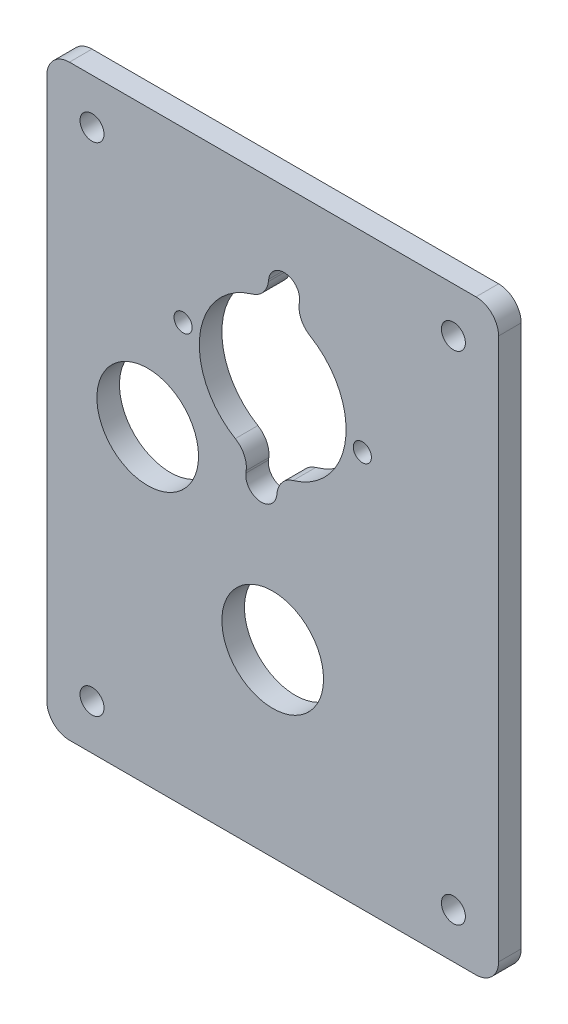
ISO-10303-21;
HEADER;
FILE_DESCRIPTION(('STEP AP214'),'2;1');
FILE_NAME('part.step','',(''),(''),'','','');
FILE_SCHEMA(('AUTOMOTIVE_DESIGN { 1 0 10303 214 1 1 1 1 }'));
ENDSEC;
DATA;
#1=APPLICATION_CONTEXT('core data for automotive mechanical design processes');
#2=APPLICATION_PROTOCOL_DEFINITION('international standard','automotive_design',2000,#1);
#3=PRODUCT_CONTEXT('',#1,'mechanical');
#4=PRODUCT('Part','Part','',(#3));
#5=PRODUCT_RELATED_PRODUCT_CATEGORY('part','',(#4));
#6=PRODUCT_DEFINITION_FORMATION('','',#4);
#7=PRODUCT_DEFINITION_CONTEXT('part definition',#1,'design');
#8=PRODUCT_DEFINITION('design','',#6,#7);
#9=PRODUCT_DEFINITION_SHAPE('','',#8);
#10=(LENGTH_UNIT() NAMED_UNIT(*) SI_UNIT(.MILLI.,.METRE.));
#11=(NAMED_UNIT(*) PLANE_ANGLE_UNIT() SI_UNIT($,.RADIAN.));
#12=(NAMED_UNIT(*) SI_UNIT($,.STERADIAN.) SOLID_ANGLE_UNIT());
#13=UNCERTAINTY_MEASURE_WITH_UNIT(LENGTH_MEASURE(1.E-05),#10,'distance_accuracy_value','');
#14=(GEOMETRIC_REPRESENTATION_CONTEXT(3) GLOBAL_UNCERTAINTY_ASSIGNED_CONTEXT((#13)) GLOBAL_UNIT_ASSIGNED_CONTEXT((#10,
#11,#12)) REPRESENTATION_CONTEXT('',''));
#15=CARTESIAN_POINT('',(0.,0.,0.));
#16=DIRECTION('',(0.,0.,1.));
#17=DIRECTION('',(1.,0.,0.));
#18=AXIS2_PLACEMENT_3D('',#15,#16,#17);
#19=CARTESIAN_POINT('',(0.,0.,6.35));
#20=DIRECTION('',(0.,0.,-1.));
#21=DIRECTION('',(-1.,0.,0.));
#22=AXIS2_PLACEMENT_3D('',#19,#20,#21);
#23=PLANE('',#22);
#24=CARTESIAN_POINT('',(-50.8,-69.8500000000001,6.35));
#25=DIRECTION('',(0.,0.,1.));
#26=DIRECTION('',(1.,0.,0.));
#27=AXIS2_PLACEMENT_3D('',#24,#25,#26);
#28=CIRCLE('',#27,3.3734375);
#29=CARTESIAN_POINT('',(-47.4265625,-69.8500000000001,6.35));
#30=VERTEX_POINT('',#29);
#31=EDGE_CURVE('E315',#30,#30,#28,.T.);
#32=ORIENTED_EDGE('',*,*,#31,.F.);
#33=EDGE_LOOP('',(#32));
#34=FACE_BOUND('',#33,.T.);
#35=CARTESIAN_POINT('',(50.8,-69.8500000000001,6.35));
#36=DIRECTION('',(0.,0.,1.));
#37=DIRECTION('',(1.,0.,0.));
#38=AXIS2_PLACEMENT_3D('',#35,#36,#37);
#39=CIRCLE('',#38,3.3734375);
#40=CARTESIAN_POINT('',(54.1734375,-69.8500000000001,6.35));
#41=VERTEX_POINT('',#40);
#42=EDGE_CURVE('E323',#41,#41,#39,.T.);
#43=ORIENTED_EDGE('',*,*,#42,.F.);
#44=EDGE_LOOP('',(#43));
#45=FACE_BOUND('',#44,.T.);
#46=CARTESIAN_POINT('',(50.8,69.8499999999999,6.35));
#47=DIRECTION('',(0.,0.,1.));
#48=DIRECTION('',(1.,0.,0.));
#49=AXIS2_PLACEMENT_3D('',#46,#47,#48);
#50=CIRCLE('',#49,3.3734375);
#51=CARTESIAN_POINT('',(54.1734375,69.8499999999999,6.35));
#52=VERTEX_POINT('',#51);
#53=EDGE_CURVE('E331',#52,#52,#50,.T.);
#54=ORIENTED_EDGE('',*,*,#53,.F.);
#55=EDGE_LOOP('',(#54));
#56=FACE_BOUND('',#55,.T.);
#57=CARTESIAN_POINT('',(-50.8,69.8499999999999,6.35));
#58=DIRECTION('',(0.,0.,1.));
#59=DIRECTION('',(1.,0.,0.));
#60=AXIS2_PLACEMENT_3D('',#57,#58,#59);
#61=CIRCLE('',#60,3.3734375);
#62=CARTESIAN_POINT('',(-47.4265625,69.8499999999999,6.35));
#63=VERTEX_POINT('',#62);
#64=EDGE_CURVE('E339',#63,#63,#61,.T.);
#65=ORIENTED_EDGE('',*,*,#64,.F.);
#66=EDGE_LOOP('',(#65));
#67=FACE_BOUND('',#66,.T.);
#68=DIRECTION('',(-1.,0.,0.));
#69=VECTOR('',#68,1.);
#70=CARTESIAN_POINT('',(-63.5,82.55,6.35));
#71=LINE('',#70,#69);
#72=CARTESIAN_POINT('',(57.15,82.55,6.35));
#73=VERTEX_POINT('',#72);
#74=CARTESIAN_POINT('',(-57.15,82.55,6.35));
#75=VERTEX_POINT('',#74);
#76=EDGE_CURVE('E351',#73,#75,#71,.T.);
#77=ORIENTED_EDGE('',*,*,#76,.T.);
#78=CARTESIAN_POINT('',(-57.15,76.2,6.35));
#79=DIRECTION('',(0.,0.,-1.));
#80=DIRECTION('',(-1.,0.,0.));
#81=AXIS2_PLACEMENT_3D('',#78,#79,#80);
#82=CIRCLE('',#81,6.35);
#83=CARTESIAN_POINT('',(-63.5,76.2,6.35));
#84=VERTEX_POINT('',#83);
#85=EDGE_CURVE('E409',#75,#84,#82,.F.);
#86=ORIENTED_EDGE('',*,*,#85,.T.);
#87=DIRECTION('',(0.,-1.,0.));
#88=VECTOR('',#87,1.);
#89=CARTESIAN_POINT('',(-63.5,-82.55,6.35));
#90=LINE('',#89,#88);
#91=CARTESIAN_POINT('',(-63.5,-76.2,6.35));
#92=VERTEX_POINT('',#91);
#93=EDGE_CURVE('E356',#84,#92,#90,.T.);
#94=ORIENTED_EDGE('',*,*,#93,.T.);
#95=CARTESIAN_POINT('',(-57.15,-76.2,6.35));
#96=DIRECTION('',(0.,0.,-1.));
#97=DIRECTION('',(-1.,0.,0.));
#98=AXIS2_PLACEMENT_3D('',#95,#96,#97);
#99=CIRCLE('',#98,6.35);
#100=CARTESIAN_POINT('',(-57.15,-82.55,6.35));
#101=VERTEX_POINT('',#100);
#102=EDGE_CURVE('E59',#92,#101,#99,.F.);
#103=ORIENTED_EDGE('',*,*,#102,.T.);
#104=DIRECTION('',(1.,0.,0.));
#105=VECTOR('',#104,1.);
#106=CARTESIAN_POINT('',(-63.5,-82.55,6.35));
#107=LINE('',#106,#105);
#108=CARTESIAN_POINT('',(57.15,-82.55,6.35));
#109=VERTEX_POINT('',#108);
#110=EDGE_CURVE('E359',#101,#109,#107,.T.);
#111=ORIENTED_EDGE('',*,*,#110,.T.);
#112=CARTESIAN_POINT('',(57.15,-76.2,6.35));
#113=DIRECTION('',(0.,0.,-1.));
#114=DIRECTION('',(-1.,0.,0.));
#115=AXIS2_PLACEMENT_3D('',#112,#113,#114);
#116=CIRCLE('',#115,6.35);
#117=CARTESIAN_POINT('',(63.5,-76.2,6.35));
#118=VERTEX_POINT('',#117);
#119=EDGE_CURVE('E404',#109,#118,#116,.F.);
#120=ORIENTED_EDGE('',*,*,#119,.T.);
#121=DIRECTION('',(0.,1.,0.));
#122=VECTOR('',#121,1.);
#123=CARTESIAN_POINT('',(63.5,-82.55,6.35));
#124=LINE('',#123,#122);
#125=CARTESIAN_POINT('',(63.5,76.2,6.35));
#126=VERTEX_POINT('',#125);
#127=EDGE_CURVE('E347',#118,#126,#124,.T.);
#128=ORIENTED_EDGE('',*,*,#127,.T.);
#129=CARTESIAN_POINT('',(57.15,76.2,6.35));
#130=DIRECTION('',(0.,0.,-1.));
#131=DIRECTION('',(-1.,0.,0.));
#132=AXIS2_PLACEMENT_3D('',#129,#130,#131);
#133=CIRCLE('',#132,6.35);
#134=EDGE_CURVE('E401',#126,#73,#133,.F.);
#135=ORIENTED_EDGE('',*,*,#134,.T.);
#136=EDGE_LOOP('',(#77,#86,#94,#103,#111,#120,#128,#135));
#137=FACE_BOUND('',#136,.T.);
#138=CARTESIAN_POINT('',(-7.51246264820109,57.8730046433233,6.35));
#139=DIRECTION('',(0.,0.,-1.));
#140=DIRECTION('',(-1.,0.,0.));
#141=AXIS2_PLACEMENT_3D('',#138,#139,#140);
#142=CIRCLE('',#141,6.35);
#143=CARTESIAN_POINT('',(-1.21307670782635,57.0728566731271,6.35));
#144=VERTEX_POINT('',#143);
#145=CARTESIAN_POINT('',(-5.74482437803613,51.7739920227553,6.35));
#146=VERTEX_POINT('',#145);
#147=EDGE_CURVE('E177',#144,#146,#142,.T.);
#148=ORIENTED_EDGE('',*,*,#147,.F.);
#149=DIRECTION('',(-0.126007554361609,-0.992029281948777,0.));
#150=VECTOR('',#149,1.);
#151=CARTESIAN_POINT('',(-1.13338564619294,57.7002465709031,6.35));
#152=LINE('',#151,#150);
#153=CARTESIAN_POINT('',(-1.13338564619293,57.7002465709031,6.35));
#154=VERTEX_POINT('',#153);
#155=EDGE_CURVE('E236',#154,#144,#152,.T.);
#156=ORIENTED_EDGE('',*,*,#155,.F.);
#157=CARTESIAN_POINT('',(3.20059188078488,57.1497447674081,6.35));
#158=DIRECTION('',(0.,0.,1.));
#159=DIRECTION('',(1.,0.,0.));
#160=AXIS2_PLACEMENT_3D('',#157,#158,#159);
#161=CIRCLE('',#160,4.3688);
#162=CARTESIAN_POINT('',(7.5345694077627,56.5992429639131,6.35));
#163=VERTEX_POINT('',#162);
#164=EDGE_CURVE('E232',#163,#154,#161,.T.);
#165=ORIENTED_EDGE('',*,*,#164,.F.);
#166=DIRECTION('',(0.12600755436161,0.992029281948777,0.));
#167=VECTOR('',#166,1.);
#168=CARTESIAN_POINT('',(7.5345694077627,56.5992429639131,6.35));
#169=LINE('',#168,#167);
#170=CARTESIAN_POINT('',(7.45487834612928,55.9718530661371,6.35));
#171=VERTEX_POINT('',#170);
#172=EDGE_CURVE('E229',#171,#163,#169,.T.);
#173=ORIENTED_EDGE('',*,*,#172,.F.);
#174=CARTESIAN_POINT('',(13.754264286504,55.1717050959409,6.35));
#175=DIRECTION('',(0.,0.,-1.));
#176=DIRECTION('',(1.,0.,0.));
#177=AXIS2_PLACEMENT_3D('',#174,#175,#176);
#178=CIRCLE('',#177,6.35);
#179=CARTESIAN_POINT('',(10.5179668073266,49.7082923688746,6.35));
#180=VERTEX_POINT('',#179);
#181=EDGE_CURVE('E226',#180,#171,#178,.T.);
#182=ORIENTED_EDGE('',*,*,#181,.F.);
#183=CARTESIAN_POINT('',(0.,31.9522010059092,6.35));
#184=DIRECTION('',(0.,0.,1.));
#185=DIRECTION('',(1.,0.,0.));
#186=AXIS2_PLACEMENT_3D('',#183,#184,#185);
#187=CIRCLE('',#186,20.6375);
#188=CARTESIAN_POINT('',(5.74482437803612,12.130409989063,6.35));
#189=VERTEX_POINT('',#188);
#190=EDGE_CURVE('E223',#189,#180,#187,.T.);
#191=ORIENTED_EDGE('',*,*,#190,.F.);
#192=CARTESIAN_POINT('',(7.51246264820108,6.031397368495,6.35));
#193=DIRECTION('',(0.,0.,-1.));
#194=DIRECTION('',(-1.,0.,0.));
#195=AXIS2_PLACEMENT_3D('',#192,#193,#194);
#196=CIRCLE('',#195,6.35);
#197=CARTESIAN_POINT('',(1.21307670782635,6.83154533869122,6.35));
#198=VERTEX_POINT('',#197);
#199=EDGE_CURVE('E220',#198,#189,#196,.T.);
#200=ORIENTED_EDGE('',*,*,#199,.F.);
#201=DIRECTION('',(0.12600755436161,0.992029281948777,0.));
#202=VECTOR('',#201,1.);
#203=CARTESIAN_POINT('',(1.13338564619293,6.20415544091522,6.35));
#204=LINE('',#203,#202);
#205=CARTESIAN_POINT('',(1.13338564619293,6.20415544091522,6.35));
#206=VERTEX_POINT('',#205);
#207=EDGE_CURVE('E217',#206,#198,#204,.T.);
#208=ORIENTED_EDGE('',*,*,#207,.F.);
#209=CARTESIAN_POINT('',(-3.20059188078489,6.75465724441022,6.35));
#210=DIRECTION('',(0.,0.,1.));
#211=DIRECTION('',(1.,0.,0.));
#212=AXIS2_PLACEMENT_3D('',#209,#210,#211);
#213=CIRCLE('',#212,4.3688);
#214=CARTESIAN_POINT('',(-7.5345694077627,7.30515904790522,6.35));
#215=VERTEX_POINT('',#214);
#216=EDGE_CURVE('E214',#215,#206,#213,.T.);
#217=ORIENTED_EDGE('',*,*,#216,.F.);
#218=DIRECTION('',(-0.126007554361615,-0.992029281948776,0.));
#219=VECTOR('',#218,1.);
#220=CARTESIAN_POINT('',(-7.5345694077627,7.30515904790522,6.35));
#221=LINE('',#220,#219);
#222=CARTESIAN_POINT('',(-7.45487834612929,7.9325489456812,6.35));
#223=VERTEX_POINT('',#222);
#224=EDGE_CURVE('E208',#223,#215,#221,.T.);
#225=ORIENTED_EDGE('',*,*,#224,.F.);
#226=CARTESIAN_POINT('',(-13.754264286504,8.73269691587744,6.35));
#227=DIRECTION('',(0.,0.,-1.));
#228=DIRECTION('',(1.,0.,0.));
#229=AXIS2_PLACEMENT_3D('',#226,#227,#228);
#230=CIRCLE('',#229,6.35);
#231=CARTESIAN_POINT('',(-10.5179668073266,14.1961096429437,6.35));
#232=VERTEX_POINT('',#231);
#233=EDGE_CURVE('E203',#232,#223,#230,.T.);
#234=ORIENTED_EDGE('',*,*,#233,.F.);
#235=CARTESIAN_POINT('',(0.,31.9522010059092,6.35));
#236=DIRECTION('',(0.,0.,1.));
#237=DIRECTION('',(1.,0.,0.));
#238=AXIS2_PLACEMENT_3D('',#235,#236,#237);
#239=CIRCLE('',#238,20.6375);
#240=EDGE_CURVE('E188',#146,#232,#239,.T.);
#241=ORIENTED_EDGE('',*,*,#240,.F.);
#242=EDGE_LOOP('',(#148,#156,#165,#173,#182,#191,#200,#208,#217,#225,#234,#241));
#243=FACE_BOUND('',#242,.T.);
#244=CARTESIAN_POINT('',(0.,-31.9522010059092,6.35));
#245=DIRECTION('',(0.,0.,1.));
#246=DIRECTION('',(1.,0.,0.));
#247=AXIS2_PLACEMENT_3D('',#244,#245,#246);
#248=CIRCLE('',#247,14.2875);
#249=CARTESIAN_POINT('',(14.2875,-31.9522010059092,6.35));
#250=VERTEX_POINT('',#249);
#251=EDGE_CURVE('E242',#250,#250,#248,.T.);
#252=ORIENTED_EDGE('',*,*,#251,.F.);
#253=EDGE_LOOP('',(#252));
#254=FACE_BOUND('',#253,.T.);
#255=CARTESIAN_POINT('',(-35.1409,4.73236178540676,6.35));
#256=DIRECTION('',(0.,0.,1.));
#257=DIRECTION('',(1.,0.,0.));
#258=AXIS2_PLACEMENT_3D('',#255,#256,#257);
#259=CIRCLE('',#258,14.2875);
#260=CARTESIAN_POINT('',(-20.8534,4.73236178540676,6.35));
#261=VERTEX_POINT('',#260);
#262=EDGE_CURVE('E593',#261,#261,#259,.T.);
#263=ORIENTED_EDGE('',*,*,#262,.F.);
#264=EDGE_LOOP('',(#263));
#265=FACE_BOUND('',#264,.T.);
#266=CARTESIAN_POINT('',(25.1975437614989,28.7516091251243,6.35));
#267=DIRECTION('',(0.,0.,1.));
#268=DIRECTION('',(1.,0.,0.));
#269=AXIS2_PLACEMENT_3D('',#266,#267,#268);
#270=CIRCLE('',#269,2.5527);
#271=CARTESIAN_POINT('',(27.7502437614989,28.7516091251243,6.35));
#272=VERTEX_POINT('',#271);
#273=EDGE_CURVE('E586',#272,#272,#270,.T.);
#274=ORIENTED_EDGE('',*,*,#273,.F.);
#275=EDGE_LOOP('',(#274));
#276=FACE_BOUND('',#275,.T.);
#277=CARTESIAN_POINT('',(-25.1975437614989,35.1527928866941,6.35));
#278=DIRECTION('',(0.,0.,1.));
#279=DIRECTION('',(1.,0.,0.));
#280=AXIS2_PLACEMENT_3D('',#277,#278,#279);
#281=CIRCLE('',#280,2.5527);
#282=CARTESIAN_POINT('',(-22.6448437614989,35.1527928866941,6.35));
#283=VERTEX_POINT('',#282);
#284=EDGE_CURVE('E579',#283,#283,#281,.T.);
#285=ORIENTED_EDGE('',*,*,#284,.F.);
#286=EDGE_LOOP('',(#285));
#287=FACE_BOUND('',#286,.T.);
#288=ADVANCED_FACE('F36',(#34,#45,#56,#67,#137,#243,#254,#265,#276,#287),#23,.F.);
#289=CARTESIAN_POINT('',(0.,0.,0.));
#290=DIRECTION('',(0.,0.,-1.));
#291=DIRECTION('',(-1.,0.,0.));
#292=AXIS2_PLACEMENT_3D('',#289,#290,#291);
#293=PLANE('',#292);
#294=CARTESIAN_POINT('',(25.1975437614989,28.7516091251243,0.));
#295=DIRECTION('',(0.,0.,1.));
#296=DIRECTION('',(1.,0.,0.));
#297=AXIS2_PLACEMENT_3D('',#294,#295,#296);
#298=CIRCLE('',#297,2.5527);
#299=CARTESIAN_POINT('',(27.7502437614989,28.7516091251243,0.));
#300=VERTEX_POINT('',#299);
#301=EDGE_CURVE('E583',#300,#300,#298,.T.);
#302=ORIENTED_EDGE('',*,*,#301,.T.);
#303=EDGE_LOOP('',(#302));
#304=FACE_BOUND('',#303,.T.);
#305=CARTESIAN_POINT('',(0.,-31.9522010059092,0.));
#306=DIRECTION('',(0.,0.,1.));
#307=DIRECTION('',(1.,0.,0.));
#308=AXIS2_PLACEMENT_3D('',#305,#306,#307);
#309=CIRCLE('',#308,14.2875);
#310=CARTESIAN_POINT('',(14.2875,-31.9522010059092,0.));
#311=VERTEX_POINT('',#310);
#312=EDGE_CURVE('E597',#311,#311,#309,.T.);
#313=ORIENTED_EDGE('',*,*,#312,.T.);
#314=EDGE_LOOP('',(#313));
#315=FACE_BOUND('',#314,.T.);
#316=CARTESIAN_POINT('',(50.8,-69.8500000000001,0.));
#317=DIRECTION('',(0.,0.,1.));
#318=DIRECTION('',(1.,0.,0.));
#319=AXIS2_PLACEMENT_3D('',#316,#317,#318);
#320=CIRCLE('',#319,3.3734375);
#321=CARTESIAN_POINT('',(54.1734375,-69.8500000000001,0.));
#322=VERTEX_POINT('',#321);
#323=EDGE_CURVE('E319',#322,#322,#320,.T.);
#324=ORIENTED_EDGE('',*,*,#323,.T.);
#325=EDGE_LOOP('',(#324));
#326=FACE_BOUND('',#325,.T.);
#327=CARTESIAN_POINT('',(-50.8,69.8499999999999,0.));
#328=DIRECTION('',(0.,0.,1.));
#329=DIRECTION('',(1.,0.,0.));
#330=AXIS2_PLACEMENT_3D('',#327,#328,#329);
#331=CIRCLE('',#330,3.3734375);
#332=CARTESIAN_POINT('',(-47.4265625,69.8499999999999,0.));
#333=VERTEX_POINT('',#332);
#334=EDGE_CURVE('E335',#333,#333,#331,.T.);
#335=ORIENTED_EDGE('',*,*,#334,.T.);
#336=EDGE_LOOP('',(#335));
#337=FACE_BOUND('',#336,.T.);
#338=DIRECTION('',(0.,-1.,0.));
#339=VECTOR('',#338,1.);
#340=CARTESIAN_POINT('',(-63.5,-82.55,0.));
#341=LINE('',#340,#339);
#342=CARTESIAN_POINT('',(-63.5,76.2,0.));
#343=VERTEX_POINT('',#342);
#344=CARTESIAN_POINT('',(-63.5,-76.2,0.));
#345=VERTEX_POINT('',#344);
#346=EDGE_CURVE('E370',#343,#345,#341,.T.);
#347=ORIENTED_EDGE('',*,*,#346,.F.);
#348=CARTESIAN_POINT('',(-57.15,76.2,0.));
#349=DIRECTION('',(0.,0.,-1.));
#350=DIRECTION('',(-1.,0.,0.));
#351=AXIS2_PLACEMENT_3D('',#348,#349,#350);
#352=CIRCLE('',#351,6.35);
#353=CARTESIAN_POINT('',(-57.15,82.55,0.));
#354=VERTEX_POINT('',#353);
#355=EDGE_CURVE('E391',#343,#354,#352,.T.);
#356=ORIENTED_EDGE('',*,*,#355,.T.);
#357=DIRECTION('',(-1.,0.,0.));
#358=VECTOR('',#357,1.);
#359=CARTESIAN_POINT('',(-63.5,82.55,0.));
#360=LINE('',#359,#358);
#361=CARTESIAN_POINT('',(57.15,82.55,0.));
#362=VERTEX_POINT('',#361);
#363=EDGE_CURVE('E366',#362,#354,#360,.T.);
#364=ORIENTED_EDGE('',*,*,#363,.F.);
#365=CARTESIAN_POINT('',(57.15,76.2,0.));
#366=DIRECTION('',(0.,0.,-1.));
#367=DIRECTION('',(-1.,0.,0.));
#368=AXIS2_PLACEMENT_3D('',#365,#366,#367);
#369=CIRCLE('',#368,6.35);
#370=CARTESIAN_POINT('',(63.5,76.2,0.));
#371=VERTEX_POINT('',#370);
#372=EDGE_CURVE('E382',#362,#371,#369,.T.);
#373=ORIENTED_EDGE('',*,*,#372,.T.);
#374=DIRECTION('',(0.,1.,0.));
#375=VECTOR('',#374,1.);
#376=CARTESIAN_POINT('',(63.5,-82.55,0.));
#377=LINE('',#376,#375);
#378=CARTESIAN_POINT('',(63.5,-76.2,0.));
#379=VERTEX_POINT('',#378);
#380=EDGE_CURVE('E343',#379,#371,#377,.T.);
#381=ORIENTED_EDGE('',*,*,#380,.F.);
#382=CARTESIAN_POINT('',(57.15,-76.2,0.));
#383=DIRECTION('',(0.,0.,-1.));
#384=DIRECTION('',(-1.,0.,0.));
#385=AXIS2_PLACEMENT_3D('',#382,#383,#384);
#386=CIRCLE('',#385,6.35);
#387=CARTESIAN_POINT('',(57.15,-82.55,0.));
#388=VERTEX_POINT('',#387);
#389=EDGE_CURVE('E385',#379,#388,#386,.T.);
#390=ORIENTED_EDGE('',*,*,#389,.T.);
#391=DIRECTION('',(1.,0.,0.));
#392=VECTOR('',#391,1.);
#393=CARTESIAN_POINT('',(-63.5,-82.55,0.));
#394=LINE('',#393,#392);
#395=CARTESIAN_POINT('',(-57.15,-82.55,0.));
#396=VERTEX_POINT('',#395);
#397=EDGE_CURVE('E352',#396,#388,#394,.T.);
#398=ORIENTED_EDGE('',*,*,#397,.F.);
#399=CARTESIAN_POINT('',(-57.15,-76.2,0.));
#400=DIRECTION('',(0.,0.,-1.));
#401=DIRECTION('',(-1.,0.,0.));
#402=AXIS2_PLACEMENT_3D('',#399,#400,#401);
#403=CIRCLE('',#402,6.35);
#404=EDGE_CURVE('E388',#396,#345,#403,.T.);
#405=ORIENTED_EDGE('',*,*,#404,.T.);
#406=EDGE_LOOP('',(#347,#356,#364,#373,#381,#390,#398,#405));
#407=FACE_BOUND('',#406,.T.);
#408=CARTESIAN_POINT('',(50.8,69.8499999999999,0.));
#409=DIRECTION('',(0.,0.,1.));
#410=DIRECTION('',(1.,0.,0.));
#411=AXIS2_PLACEMENT_3D('',#408,#409,#410);
#412=CIRCLE('',#411,3.3734375);
#413=CARTESIAN_POINT('',(54.1734375,69.8499999999999,0.));
#414=VERTEX_POINT('',#413);
#415=EDGE_CURVE('E327',#414,#414,#412,.T.);
#416=ORIENTED_EDGE('',*,*,#415,.T.);
#417=EDGE_LOOP('',(#416));
#418=FACE_BOUND('',#417,.T.);
#419=CARTESIAN_POINT('',(-50.8,-69.8500000000001,0.));
#420=DIRECTION('',(0.,0.,1.));
#421=DIRECTION('',(1.,0.,0.));
#422=AXIS2_PLACEMENT_3D('',#419,#420,#421);
#423=CIRCLE('',#422,3.3734375);
#424=CARTESIAN_POINT('',(-47.4265625,-69.8500000000001,0.));
#425=VERTEX_POINT('',#424);
#426=EDGE_CURVE('E197',#425,#425,#423,.T.);
#427=ORIENTED_EDGE('',*,*,#426,.T.);
#428=EDGE_LOOP('',(#427));
#429=FACE_BOUND('',#428,.T.);
#430=DIRECTION('',(-0.126007554361609,-0.992029281948777,0.));
#431=VECTOR('',#430,1.);
#432=CARTESIAN_POINT('',(-1.13338564619294,57.7002465709031,0.));
#433=LINE('',#432,#431);
#434=CARTESIAN_POINT('',(-1.13338564619294,57.7002465709031,0.));
#435=VERTEX_POINT('',#434);
#436=CARTESIAN_POINT('',(-1.21307670782635,57.0728566731271,0.));
#437=VERTEX_POINT('',#436);
#438=EDGE_CURVE('E189',#435,#437,#433,.T.);
#439=ORIENTED_EDGE('',*,*,#438,.T.);
#440=CARTESIAN_POINT('',(-7.51246264820109,57.8730046433233,0.));
#441=DIRECTION('',(0.,0.,-1.));
#442=DIRECTION('',(-1.,0.,0.));
#443=AXIS2_PLACEMENT_3D('',#440,#441,#442);
#444=CIRCLE('',#443,6.35);
#445=CARTESIAN_POINT('',(-5.74482437803613,51.7739920227553,0.));
#446=VERTEX_POINT('',#445);
#447=EDGE_CURVE('E239',#437,#446,#444,.T.);
#448=ORIENTED_EDGE('',*,*,#447,.T.);
#449=CARTESIAN_POINT('',(0.,31.9522010059092,0.));
#450=DIRECTION('',(0.,0.,1.));
#451=DIRECTION('',(1.,0.,0.));
#452=AXIS2_PLACEMENT_3D('',#449,#450,#451);
#453=CIRCLE('',#452,20.6375);
#454=CARTESIAN_POINT('',(-10.5179668073266,14.1961096429437,0.));
#455=VERTEX_POINT('',#454);
#456=EDGE_CURVE('E195',#446,#455,#453,.T.);
#457=ORIENTED_EDGE('',*,*,#456,.T.);
#458=CARTESIAN_POINT('',(-13.754264286504,8.73269691587744,0.));
#459=DIRECTION('',(0.,0.,-1.));
#460=DIRECTION('',(1.,0.,0.));
#461=AXIS2_PLACEMENT_3D('',#458,#459,#460);
#462=CIRCLE('',#461,6.35);
#463=CARTESIAN_POINT('',(-7.45487834612929,7.9325489456812,0.));
#464=VERTEX_POINT('',#463);
#465=EDGE_CURVE('E245',#455,#464,#462,.T.);
#466=ORIENTED_EDGE('',*,*,#465,.T.);
#467=DIRECTION('',(-0.126007554361615,-0.992029281948776,0.));
#468=VECTOR('',#467,1.);
#469=CARTESIAN_POINT('',(-7.5345694077627,7.30515904790522,0.));
#470=LINE('',#469,#468);
#471=CARTESIAN_POINT('',(-7.5345694077627,7.30515904790522,0.));
#472=VERTEX_POINT('',#471);
#473=EDGE_CURVE('E249',#464,#472,#470,.T.);
#474=ORIENTED_EDGE('',*,*,#473,.T.);
#475=CARTESIAN_POINT('',(-3.20059188078489,6.75465724441022,0.));
#476=DIRECTION('',(0.,0.,1.));
#477=DIRECTION('',(1.,0.,0.));
#478=AXIS2_PLACEMENT_3D('',#475,#476,#477);
#479=CIRCLE('',#478,4.3688);
#480=CARTESIAN_POINT('',(1.13338564619293,6.20415544091522,0.));
#481=VERTEX_POINT('',#480);
#482=EDGE_CURVE('E253',#472,#481,#479,.T.);
#483=ORIENTED_EDGE('',*,*,#482,.T.);
#484=DIRECTION('',(0.12600755436161,0.992029281948777,0.));
#485=VECTOR('',#484,1.);
#486=CARTESIAN_POINT('',(1.13338564619293,6.20415544091522,0.));
#487=LINE('',#486,#485);
#488=CARTESIAN_POINT('',(1.21307670782635,6.83154533869122,0.));
#489=VERTEX_POINT('',#488);
#490=EDGE_CURVE('E257',#481,#489,#487,.T.);
#491=ORIENTED_EDGE('',*,*,#490,.T.);
#492=CARTESIAN_POINT('',(7.51246264820108,6.031397368495,0.));
#493=DIRECTION('',(0.,0.,-1.));
#494=DIRECTION('',(-1.,0.,0.));
#495=AXIS2_PLACEMENT_3D('',#492,#493,#494);
#496=CIRCLE('',#495,6.35);
#497=CARTESIAN_POINT('',(5.74482437803612,12.130409989063,0.));
#498=VERTEX_POINT('',#497);
#499=EDGE_CURVE('E261',#489,#498,#496,.T.);
#500=ORIENTED_EDGE('',*,*,#499,.T.);
#501=CARTESIAN_POINT('',(0.,31.9522010059092,0.));
#502=DIRECTION('',(0.,0.,1.));
#503=DIRECTION('',(1.,0.,0.));
#504=AXIS2_PLACEMENT_3D('',#501,#502,#503);
#505=CIRCLE('',#504,20.6375);
#506=CARTESIAN_POINT('',(10.5179668073266,49.7082923688746,0.));
#507=VERTEX_POINT('',#506);
#508=EDGE_CURVE('E265',#498,#507,#505,.T.);
#509=ORIENTED_EDGE('',*,*,#508,.T.);
#510=CARTESIAN_POINT('',(13.754264286504,55.1717050959409,0.));
#511=DIRECTION('',(0.,0.,-1.));
#512=DIRECTION('',(1.,0.,0.));
#513=AXIS2_PLACEMENT_3D('',#510,#511,#512);
#514=CIRCLE('',#513,6.35);
#515=CARTESIAN_POINT('',(7.45487834612928,55.9718530661371,0.));
#516=VERTEX_POINT('',#515);
#517=EDGE_CURVE('E269',#507,#516,#514,.T.);
#518=ORIENTED_EDGE('',*,*,#517,.T.);
#519=DIRECTION('',(0.12600755436161,0.992029281948777,0.));
#520=VECTOR('',#519,1.);
#521=CARTESIAN_POINT('',(7.5345694077627,56.5992429639131,0.));
#522=LINE('',#521,#520);
#523=CARTESIAN_POINT('',(7.5345694077627,56.5992429639131,0.));
#524=VERTEX_POINT('',#523);
#525=EDGE_CURVE('E273',#516,#524,#522,.T.);
#526=ORIENTED_EDGE('',*,*,#525,.T.);
#527=CARTESIAN_POINT('',(3.20059188078488,57.1497447674081,0.));
#528=DIRECTION('',(0.,0.,1.));
#529=DIRECTION('',(1.,0.,0.));
#530=AXIS2_PLACEMENT_3D('',#527,#528,#529);
#531=CIRCLE('',#530,4.3688);
#532=EDGE_CURVE('E277',#524,#435,#531,.T.);
#533=ORIENTED_EDGE('',*,*,#532,.T.);
#534=EDGE_LOOP('',(#439,#448,#457,#466,#474,#483,#491,#500,#509,#518,#526,#533));
#535=FACE_BOUND('',#534,.T.);
#536=CARTESIAN_POINT('',(-35.1409,4.73236178540676,0.));
#537=DIRECTION('',(0.,0.,1.));
#538=DIRECTION('',(1.,0.,0.));
#539=AXIS2_PLACEMENT_3D('',#536,#537,#538);
#540=CIRCLE('',#539,14.2875);
#541=CARTESIAN_POINT('',(-20.8534,4.73236178540676,0.));
#542=VERTEX_POINT('',#541);
#543=EDGE_CURVE('E574',#542,#542,#540,.T.);
#544=ORIENTED_EDGE('',*,*,#543,.T.);
#545=EDGE_LOOP('',(#544));
#546=FACE_BOUND('',#545,.T.);
#547=CARTESIAN_POINT('',(-25.1975437614989,35.1527928866941,0.));
#548=DIRECTION('',(0.,0.,1.));
#549=DIRECTION('',(1.,0.,0.));
#550=AXIS2_PLACEMENT_3D('',#547,#548,#549);
#551=CIRCLE('',#550,2.5527);
#552=CARTESIAN_POINT('',(-22.6448437614989,35.1527928866941,0.));
#553=VERTEX_POINT('',#552);
#554=EDGE_CURVE('E577',#553,#553,#551,.T.);
#555=ORIENTED_EDGE('',*,*,#554,.T.);
#556=EDGE_LOOP('',(#555));
#557=FACE_BOUND('',#556,.T.);
#558=ADVANCED_FACE('F436',(#304,#315,#326,#337,#407,#418,#429,#535,#546,#557),#293,.T.);
#559=CARTESIAN_POINT('',(63.5,-82.55,6.35));
#560=DIRECTION('',(-1.,0.,0.));
#561=DIRECTION('',(0.,0.,1.));
#562=AXIS2_PLACEMENT_3D('',#559,#560,#561);
#563=PLANE('',#562);
#564=ORIENTED_EDGE('',*,*,#127,.F.);
#565=DIRECTION('',(0.,0.,-1.));
#566=VECTOR('',#565,1.);
#567=CARTESIAN_POINT('',(63.5,-76.2,6.35));
#568=LINE('',#567,#566);
#569=EDGE_CURVE('E11',#118,#379,#568,.T.);
#570=ORIENTED_EDGE('',*,*,#569,.T.);
#571=ORIENTED_EDGE('',*,*,#380,.T.);
#572=DIRECTION('',(0.,0.,-1.));
#573=VECTOR('',#572,1.);
#574=CARTESIAN_POINT('',(63.5,76.2,6.35));
#575=LINE('',#574,#573);
#576=EDGE_CURVE('E45',#371,#126,#575,.F.);
#577=ORIENTED_EDGE('',*,*,#576,.T.);
#578=EDGE_LOOP('',(#564,#570,#571,#577));
#579=FACE_BOUND('',#578,.T.);
#580=ADVANCED_FACE('F422',(#579),#563,.F.);
#581=CARTESIAN_POINT('',(-63.5,82.55,6.35));
#582=DIRECTION('',(0.,-1.,0.));
#583=DIRECTION('',(0.,0.,-1.));
#584=AXIS2_PLACEMENT_3D('',#581,#582,#583);
#585=PLANE('',#584);
#586=ORIENTED_EDGE('',*,*,#363,.T.);
#587=DIRECTION('',(0.,0.,-1.));
#588=VECTOR('',#587,1.);
#589=CARTESIAN_POINT('',(-57.15,82.55,6.35));
#590=LINE('',#589,#588);
#591=EDGE_CURVE('E398',#354,#75,#590,.F.);
#592=ORIENTED_EDGE('',*,*,#591,.T.);
#593=ORIENTED_EDGE('',*,*,#76,.F.);
#594=DIRECTION('',(0.,0.,-1.));
#595=VECTOR('',#594,1.);
#596=CARTESIAN_POINT('',(57.15,82.55,6.35));
#597=LINE('',#596,#595);
#598=EDGE_CURVE('E394',#73,#362,#597,.T.);
#599=ORIENTED_EDGE('',*,*,#598,.T.);
#600=EDGE_LOOP('',(#586,#592,#593,#599));
#601=FACE_BOUND('',#600,.T.);
#602=ADVANCED_FACE('F432',(#601),#585,.F.);
#603=CARTESIAN_POINT('',(-63.5,-82.55,6.35));
#604=DIRECTION('',(1.,0.,0.));
#605=DIRECTION('',(0.,0.,-1.));
#606=AXIS2_PLACEMENT_3D('',#603,#604,#605);
#607=PLANE('',#606);
#608=ORIENTED_EDGE('',*,*,#93,.F.);
#609=DIRECTION('',(0.,0.,-1.));
#610=VECTOR('',#609,1.);
#611=CARTESIAN_POINT('',(-63.5,76.2,6.35));
#612=LINE('',#611,#610);
#613=EDGE_CURVE('E378',#84,#343,#612,.T.);
#614=ORIENTED_EDGE('',*,*,#613,.T.);
#615=ORIENTED_EDGE('',*,*,#346,.T.);
#616=DIRECTION('',(0.,0.,-1.));
#617=VECTOR('',#616,1.);
#618=CARTESIAN_POINT('',(-63.5,-76.2,6.35));
#619=LINE('',#618,#617);
#620=EDGE_CURVE('E362',#345,#92,#619,.F.);
#621=ORIENTED_EDGE('',*,*,#620,.T.);
#622=EDGE_LOOP('',(#608,#614,#615,#621));
#623=FACE_BOUND('',#622,.T.);
#624=ADVANCED_FACE('F444',(#623),#607,.F.);
#625=CARTESIAN_POINT('',(-63.5,-82.55,6.35));
#626=DIRECTION('',(0.,1.,0.));
#627=DIRECTION('',(0.,0.,1.));
#628=AXIS2_PLACEMENT_3D('',#625,#626,#627);
#629=PLANE('',#628);
#630=ORIENTED_EDGE('',*,*,#110,.F.);
#631=DIRECTION('',(0.,0.,-1.));
#632=VECTOR('',#631,1.);
#633=CARTESIAN_POINT('',(-57.15,-82.55,6.35));
#634=LINE('',#633,#632);
#635=EDGE_CURVE('E414',#101,#396,#634,.T.);
#636=ORIENTED_EDGE('',*,*,#635,.T.);
#637=ORIENTED_EDGE('',*,*,#397,.T.);
#638=DIRECTION('',(0.,0.,-1.));
#639=VECTOR('',#638,1.);
#640=CARTESIAN_POINT('',(57.15,-82.55,6.35));
#641=LINE('',#640,#639);
#642=EDGE_CURVE('E52',#388,#109,#641,.F.);
#643=ORIENTED_EDGE('',*,*,#642,.T.);
#644=EDGE_LOOP('',(#630,#636,#637,#643));
#645=FACE_BOUND('',#644,.T.);
#646=ADVANCED_FACE('F450',(#645),#629,.F.);
#647=CARTESIAN_POINT('',(-50.8,69.8499999999999,6.35));
#648=DIRECTION('',(0.,0.,-1.));
#649=DIRECTION('',(-1.,0.,0.));
#650=AXIS2_PLACEMENT_3D('',#647,#648,#649);
#651=CYLINDRICAL_SURFACE('',#650,3.3734375);
#652=ORIENTED_EDGE('',*,*,#64,.T.);
#653=EDGE_LOOP('',(#652));
#654=FACE_BOUND('',#653,.T.);
#655=ORIENTED_EDGE('',*,*,#334,.F.);
#656=EDGE_LOOP('',(#655));
#657=FACE_BOUND('',#656,.T.);
#658=ADVANCED_FACE('F470',(#654,#657),#651,.F.);
#659=CARTESIAN_POINT('',(50.8,69.8499999999999,6.35));
#660=DIRECTION('',(0.,0.,-1.));
#661=DIRECTION('',(-1.,0.,0.));
#662=AXIS2_PLACEMENT_3D('',#659,#660,#661);
#663=CYLINDRICAL_SURFACE('',#662,3.3734375);
#664=ORIENTED_EDGE('',*,*,#53,.T.);
#665=EDGE_LOOP('',(#664));
#666=FACE_BOUND('',#665,.T.);
#667=ORIENTED_EDGE('',*,*,#415,.F.);
#668=EDGE_LOOP('',(#667));
#669=FACE_BOUND('',#668,.T.);
#670=ADVANCED_FACE('F555',(#666,#669),#663,.F.);
#671=CARTESIAN_POINT('',(50.8,-69.8500000000001,6.35));
#672=DIRECTION('',(0.,0.,-1.));
#673=DIRECTION('',(-1.,0.,0.));
#674=AXIS2_PLACEMENT_3D('',#671,#672,#673);
#675=CYLINDRICAL_SURFACE('',#674,3.3734375);
#676=ORIENTED_EDGE('',*,*,#42,.T.);
#677=EDGE_LOOP('',(#676));
#678=FACE_BOUND('',#677,.T.);
#679=ORIENTED_EDGE('',*,*,#323,.F.);
#680=EDGE_LOOP('',(#679));
#681=FACE_BOUND('',#680,.T.);
#682=ADVANCED_FACE('F552',(#678,#681),#675,.F.);
#683=CARTESIAN_POINT('',(-50.8,-69.8500000000001,6.35));
#684=DIRECTION('',(0.,0.,-1.));
#685=DIRECTION('',(-1.,0.,0.));
#686=AXIS2_PLACEMENT_3D('',#683,#684,#685);
#687=CYLINDRICAL_SURFACE('',#686,3.3734375);
#688=ORIENTED_EDGE('',*,*,#31,.T.);
#689=EDGE_LOOP('',(#688));
#690=FACE_BOUND('',#689,.T.);
#691=ORIENTED_EDGE('',*,*,#426,.F.);
#692=EDGE_LOOP('',(#691));
#693=FACE_BOUND('',#692,.T.);
#694=ADVANCED_FACE('F549',(#690,#693),#687,.F.);
#695=CARTESIAN_POINT('',(-7.51246264820109,57.8730046433233,6.35));
#696=DIRECTION('',(0.,0.,-1.));
#697=DIRECTION('',(-1.,0.,0.));
#698=AXIS2_PLACEMENT_3D('',#695,#696,#697);
#699=CYLINDRICAL_SURFACE('',#698,6.35);
#700=ORIENTED_EDGE('',*,*,#447,.F.);
#701=DIRECTION('',(0.,0.,-1.));
#702=VECTOR('',#701,1.);
#703=CARTESIAN_POINT('',(-1.21307670782635,57.0728566731271,6.35));
#704=LINE('',#703,#702);
#705=EDGE_CURVE('E183',#144,#437,#704,.T.);
#706=ORIENTED_EDGE('',*,*,#705,.F.);
#707=ORIENTED_EDGE('',*,*,#147,.T.);
#708=DIRECTION('',(0.,0.,-1.));
#709=VECTOR('',#708,1.);
#710=CARTESIAN_POINT('',(-5.74482437803613,51.7739920227553,6.35));
#711=LINE('',#710,#709);
#712=EDGE_CURVE('E180',#146,#446,#711,.T.);
#713=ORIENTED_EDGE('',*,*,#712,.T.);
#714=EDGE_LOOP('',(#700,#706,#707,#713));
#715=FACE_BOUND('',#714,.T.);
#716=ADVANCED_FACE('F179',(#715),#699,.T.);
#717=CARTESIAN_POINT('',(0.,31.9522010059092,6.35));
#718=DIRECTION('',(0.,0.,-1.));
#719=DIRECTION('',(-1.,0.,0.));
#720=AXIS2_PLACEMENT_3D('',#717,#718,#719);
#721=CYLINDRICAL_SURFACE('',#720,20.6375);
#722=ORIENTED_EDGE('',*,*,#456,.F.);
#723=ORIENTED_EDGE('',*,*,#712,.F.);
#724=ORIENTED_EDGE('',*,*,#240,.T.);
#725=DIRECTION('',(0.,0.,-1.));
#726=VECTOR('',#725,1.);
#727=CARTESIAN_POINT('',(-10.5179668073266,14.1961096429437,6.35));
#728=LINE('',#727,#726);
#729=EDGE_CURVE('E198',#232,#455,#728,.T.);
#730=ORIENTED_EDGE('',*,*,#729,.T.);
#731=EDGE_LOOP('',(#722,#723,#724,#730));
#732=FACE_BOUND('',#731,.T.);
#733=ADVANCED_FACE('F192',(#732),#721,.F.);
#734=CARTESIAN_POINT('',(-13.754264286504,8.73269691587744,6.35));
#735=DIRECTION('',(0.,0.,-1.));
#736=DIRECTION('',(-1.,0.,0.));
#737=AXIS2_PLACEMENT_3D('',#734,#735,#736);
#738=CYLINDRICAL_SURFACE('',#737,6.35);
#739=ORIENTED_EDGE('',*,*,#465,.F.);
#740=ORIENTED_EDGE('',*,*,#729,.F.);
#741=ORIENTED_EDGE('',*,*,#233,.T.);
#742=DIRECTION('',(0.,0.,-1.));
#743=VECTOR('',#742,1.);
#744=CARTESIAN_POINT('',(-7.45487834612929,7.9325489456812,6.35));
#745=LINE('',#744,#743);
#746=EDGE_CURVE('E310',#223,#464,#745,.T.);
#747=ORIENTED_EDGE('',*,*,#746,.T.);
#748=EDGE_LOOP('',(#739,#740,#741,#747));
#749=FACE_BOUND('',#748,.T.);
#750=ADVANCED_FACE('F540',(#749),#738,.T.);
#751=CARTESIAN_POINT('',(-7.5345694077627,7.30515904790522,6.35));
#752=DIRECTION('',(0.992029281948776,-0.126007554361615,0.));
#753=DIRECTION('',(0.126007554361615,0.992029281948776,0.));
#754=AXIS2_PLACEMENT_3D('',#751,#752,#753);
#755=PLANE('',#754);
#756=ORIENTED_EDGE('',*,*,#473,.F.);
#757=ORIENTED_EDGE('',*,*,#746,.F.);
#758=ORIENTED_EDGE('',*,*,#224,.T.);
#759=DIRECTION('',(0.,0.,-1.));
#760=VECTOR('',#759,1.);
#761=CARTESIAN_POINT('',(-7.5345694077627,7.30515904790522,6.35));
#762=LINE('',#761,#760);
#763=EDGE_CURVE('E307',#215,#472,#762,.T.);
#764=ORIENTED_EDGE('',*,*,#763,.T.);
#765=EDGE_LOOP('',(#756,#757,#758,#764));
#766=FACE_BOUND('',#765,.T.);
#767=ADVANCED_FACE('F536',(#766),#755,.T.);
#768=CARTESIAN_POINT('',(-3.20059188078489,6.75465724441022,6.35));
#769=DIRECTION('',(0.,0.,-1.));
#770=DIRECTION('',(-1.,0.,0.));
#771=AXIS2_PLACEMENT_3D('',#768,#769,#770);
#772=CYLINDRICAL_SURFACE('',#771,4.3688);
#773=ORIENTED_EDGE('',*,*,#482,.F.);
#774=ORIENTED_EDGE('',*,*,#763,.F.);
#775=ORIENTED_EDGE('',*,*,#216,.T.);
#776=DIRECTION('',(0.,0.,-1.));
#777=VECTOR('',#776,1.);
#778=CARTESIAN_POINT('',(1.13338564619293,6.20415544091522,6.35));
#779=LINE('',#778,#777);
#780=EDGE_CURVE('E304',#206,#481,#779,.T.);
#781=ORIENTED_EDGE('',*,*,#780,.T.);
#782=EDGE_LOOP('',(#773,#774,#775,#781));
#783=FACE_BOUND('',#782,.T.);
#784=ADVANCED_FACE('F532',(#783),#772,.F.);
#785=CARTESIAN_POINT('',(1.13338564619293,6.20415544091522,6.35));
#786=DIRECTION('',(-0.992029281948777,0.12600755436161,0.));
#787=DIRECTION('',(-0.12600755436161,-0.992029281948777,0.));
#788=AXIS2_PLACEMENT_3D('',#785,#786,#787);
#789=PLANE('',#788);
#790=ORIENTED_EDGE('',*,*,#490,.F.);
#791=ORIENTED_EDGE('',*,*,#780,.F.);
#792=ORIENTED_EDGE('',*,*,#207,.T.);
#793=DIRECTION('',(0.,0.,-1.));
#794=VECTOR('',#793,1.);
#795=CARTESIAN_POINT('',(1.21307670782635,6.83154533869122,6.35));
#796=LINE('',#795,#794);
#797=EDGE_CURVE('E301',#198,#489,#796,.T.);
#798=ORIENTED_EDGE('',*,*,#797,.T.);
#799=EDGE_LOOP('',(#790,#791,#792,#798));
#800=FACE_BOUND('',#799,.T.);
#801=ADVANCED_FACE('F528',(#800),#789,.T.);
#802=CARTESIAN_POINT('',(7.51246264820108,6.031397368495,6.35));
#803=DIRECTION('',(0.,0.,-1.));
#804=DIRECTION('',(-1.,0.,0.));
#805=AXIS2_PLACEMENT_3D('',#802,#803,#804);
#806=CYLINDRICAL_SURFACE('',#805,6.35);
#807=ORIENTED_EDGE('',*,*,#499,.F.);
#808=ORIENTED_EDGE('',*,*,#797,.F.);
#809=ORIENTED_EDGE('',*,*,#199,.T.);
#810=DIRECTION('',(0.,0.,-1.));
#811=VECTOR('',#810,1.);
#812=CARTESIAN_POINT('',(5.74482437803612,12.130409989063,6.35));
#813=LINE('',#812,#811);
#814=EDGE_CURVE('E298',#189,#498,#813,.T.);
#815=ORIENTED_EDGE('',*,*,#814,.T.);
#816=EDGE_LOOP('',(#807,#808,#809,#815));
#817=FACE_BOUND('',#816,.T.);
#818=ADVANCED_FACE('F524',(#817),#806,.T.);
#819=CARTESIAN_POINT('',(0.,31.9522010059092,6.35));
#820=DIRECTION('',(0.,0.,-1.));
#821=DIRECTION('',(-1.,0.,0.));
#822=AXIS2_PLACEMENT_3D('',#819,#820,#821);
#823=CYLINDRICAL_SURFACE('',#822,20.6375);
#824=ORIENTED_EDGE('',*,*,#508,.F.);
#825=ORIENTED_EDGE('',*,*,#814,.F.);
#826=ORIENTED_EDGE('',*,*,#190,.T.);
#827=DIRECTION('',(0.,0.,-1.));
#828=VECTOR('',#827,1.);
#829=CARTESIAN_POINT('',(10.5179668073266,49.7082923688746,6.35));
#830=LINE('',#829,#828);
#831=EDGE_CURVE('E295',#180,#507,#830,.T.);
#832=ORIENTED_EDGE('',*,*,#831,.T.);
#833=EDGE_LOOP('',(#824,#825,#826,#832));
#834=FACE_BOUND('',#833,.T.);
#835=ADVANCED_FACE('F520',(#834),#823,.F.);
#836=CARTESIAN_POINT('',(13.754264286504,55.1717050959409,6.35));
#837=DIRECTION('',(0.,0.,-1.));
#838=DIRECTION('',(-1.,0.,0.));
#839=AXIS2_PLACEMENT_3D('',#836,#837,#838);
#840=CYLINDRICAL_SURFACE('',#839,6.35);
#841=ORIENTED_EDGE('',*,*,#517,.F.);
#842=ORIENTED_EDGE('',*,*,#831,.F.);
#843=ORIENTED_EDGE('',*,*,#181,.T.);
#844=DIRECTION('',(0.,0.,-1.));
#845=VECTOR('',#844,1.);
#846=CARTESIAN_POINT('',(7.45487834612928,55.9718530661371,6.35));
#847=LINE('',#846,#845);
#848=EDGE_CURVE('E292',#171,#516,#847,.T.);
#849=ORIENTED_EDGE('',*,*,#848,.T.);
#850=EDGE_LOOP('',(#841,#842,#843,#849));
#851=FACE_BOUND('',#850,.T.);
#852=ADVANCED_FACE('F516',(#851),#840,.T.);
#853=CARTESIAN_POINT('',(7.5345694077627,56.5992429639131,6.35));
#854=DIRECTION('',(-0.992029281948777,0.12600755436161,0.));
#855=DIRECTION('',(-0.12600755436161,-0.992029281948777,0.));
#856=AXIS2_PLACEMENT_3D('',#853,#854,#855);
#857=PLANE('',#856);
#858=ORIENTED_EDGE('',*,*,#525,.F.);
#859=ORIENTED_EDGE('',*,*,#848,.F.);
#860=ORIENTED_EDGE('',*,*,#172,.T.);
#861=DIRECTION('',(0.,0.,-1.));
#862=VECTOR('',#861,1.);
#863=CARTESIAN_POINT('',(7.5345694077627,56.5992429639131,6.35));
#864=LINE('',#863,#862);
#865=EDGE_CURVE('E289',#163,#524,#864,.T.);
#866=ORIENTED_EDGE('',*,*,#865,.T.);
#867=EDGE_LOOP('',(#858,#859,#860,#866));
#868=FACE_BOUND('',#867,.T.);
#869=ADVANCED_FACE('F512',(#868),#857,.T.);
#870=CARTESIAN_POINT('',(3.20059188078488,57.1497447674081,6.35));
#871=DIRECTION('',(0.,0.,-1.));
#872=DIRECTION('',(-1.,0.,0.));
#873=AXIS2_PLACEMENT_3D('',#870,#871,#872);
#874=CYLINDRICAL_SURFACE('',#873,4.3688);
#875=ORIENTED_EDGE('',*,*,#532,.F.);
#876=ORIENTED_EDGE('',*,*,#865,.F.);
#877=ORIENTED_EDGE('',*,*,#164,.T.);
#878=DIRECTION('',(0.,0.,-1.));
#879=VECTOR('',#878,1.);
#880=CARTESIAN_POINT('',(-1.13338564619294,57.7002465709031,6.35));
#881=LINE('',#880,#879);
#882=EDGE_CURVE('E286',#154,#435,#881,.T.);
#883=ORIENTED_EDGE('',*,*,#882,.T.);
#884=EDGE_LOOP('',(#875,#876,#877,#883));
#885=FACE_BOUND('',#884,.T.);
#886=ADVANCED_FACE('F508',(#885),#874,.F.);
#887=CARTESIAN_POINT('',(-1.13338564619294,57.7002465709031,6.35));
#888=DIRECTION('',(0.992029281948777,-0.126007554361609,0.));
#889=DIRECTION('',(0.126007554361609,0.992029281948777,0.));
#890=AXIS2_PLACEMENT_3D('',#887,#888,#889);
#891=PLANE('',#890);
#892=ORIENTED_EDGE('',*,*,#438,.F.);
#893=ORIENTED_EDGE('',*,*,#882,.F.);
#894=ORIENTED_EDGE('',*,*,#155,.T.);
#895=ORIENTED_EDGE('',*,*,#705,.T.);
#896=EDGE_LOOP('',(#892,#893,#894,#895));
#897=FACE_BOUND('',#896,.T.);
#898=ADVANCED_FACE('F504',(#897),#891,.T.);
#899=CARTESIAN_POINT('',(0.,-31.9522010059092,6.35));
#900=DIRECTION('',(0.,0.,-1.));
#901=DIRECTION('',(-1.,0.,0.));
#902=AXIS2_PLACEMENT_3D('',#899,#900,#901);
#903=CYLINDRICAL_SURFACE('',#902,14.2875);
#904=ORIENTED_EDGE('',*,*,#251,.T.);
#905=EDGE_LOOP('',(#904));
#906=FACE_BOUND('',#905,.T.);
#907=ORIENTED_EDGE('',*,*,#312,.F.);
#908=EDGE_LOOP('',(#907));
#909=FACE_BOUND('',#908,.T.);
#910=ADVANCED_FACE('F500',(#906,#909),#903,.F.);
#911=CARTESIAN_POINT('',(-35.1409,4.73236178540676,6.35));
#912=DIRECTION('',(0.,0.,-1.));
#913=DIRECTION('',(-1.,0.,0.));
#914=AXIS2_PLACEMENT_3D('',#911,#912,#913);
#915=CYLINDRICAL_SURFACE('',#914,14.2875);
#916=ORIENTED_EDGE('',*,*,#262,.T.);
#917=EDGE_LOOP('',(#916));
#918=FACE_BOUND('',#917,.T.);
#919=ORIENTED_EDGE('',*,*,#543,.F.);
#920=EDGE_LOOP('',(#919));
#921=FACE_BOUND('',#920,.T.);
#922=ADVANCED_FACE('F492',(#918,#921),#915,.F.);
#923=CARTESIAN_POINT('',(25.1975437614989,28.7516091251243,6.35));
#924=DIRECTION('',(0.,0.,-1.));
#925=DIRECTION('',(-1.,0.,0.));
#926=AXIS2_PLACEMENT_3D('',#923,#924,#925);
#927=CYLINDRICAL_SURFACE('',#926,2.5527);
#928=ORIENTED_EDGE('',*,*,#273,.T.);
#929=EDGE_LOOP('',(#928));
#930=FACE_BOUND('',#929,.T.);
#931=ORIENTED_EDGE('',*,*,#301,.F.);
#932=EDGE_LOOP('',(#931));
#933=FACE_BOUND('',#932,.T.);
#934=ADVANCED_FACE('F486',(#930,#933),#927,.F.);
#935=CARTESIAN_POINT('',(-25.1975437614989,35.1527928866941,6.35));
#936=DIRECTION('',(0.,0.,-1.));
#937=DIRECTION('',(-1.,0.,0.));
#938=AXIS2_PLACEMENT_3D('',#935,#936,#937);
#939=CYLINDRICAL_SURFACE('',#938,2.5527);
#940=ORIENTED_EDGE('',*,*,#284,.T.);
#941=EDGE_LOOP('',(#940));
#942=FACE_BOUND('',#941,.T.);
#943=ORIENTED_EDGE('',*,*,#554,.F.);
#944=EDGE_LOOP('',(#943));
#945=FACE_BOUND('',#944,.T.);
#946=ADVANCED_FACE('F482',(#942,#945),#939,.F.);
#947=CARTESIAN_POINT('',(-57.15,76.2,6.35));
#948=DIRECTION('',(0.,0.,-1.));
#949=DIRECTION('',(-1.,0.,0.));
#950=AXIS2_PLACEMENT_3D('',#947,#948,#949);
#951=CYLINDRICAL_SURFACE('',#950,6.35);
#952=ORIENTED_EDGE('',*,*,#85,.F.);
#953=ORIENTED_EDGE('',*,*,#591,.F.);
#954=ORIENTED_EDGE('',*,*,#355,.F.);
#955=ORIENTED_EDGE('',*,*,#613,.F.);
#956=EDGE_LOOP('',(#952,#953,#954,#955));
#957=FACE_BOUND('',#956,.T.);
#958=ADVANCED_FACE('F441',(#957),#951,.T.);
#959=CARTESIAN_POINT('',(-57.15,-76.2,6.35));
#960=DIRECTION('',(0.,0.,-1.));
#961=DIRECTION('',(-1.,0.,0.));
#962=AXIS2_PLACEMENT_3D('',#959,#960,#961);
#963=CYLINDRICAL_SURFACE('',#962,6.35);
#964=ORIENTED_EDGE('',*,*,#102,.F.);
#965=ORIENTED_EDGE('',*,*,#620,.F.);
#966=ORIENTED_EDGE('',*,*,#404,.F.);
#967=ORIENTED_EDGE('',*,*,#635,.F.);
#968=EDGE_LOOP('',(#964,#965,#966,#967));
#969=FACE_BOUND('',#968,.T.);
#970=ADVANCED_FACE('F448',(#969),#963,.T.);
#971=CARTESIAN_POINT('',(57.15,-76.2,6.35));
#972=DIRECTION('',(0.,0.,-1.));
#973=DIRECTION('',(-1.,0.,0.));
#974=AXIS2_PLACEMENT_3D('',#971,#972,#973);
#975=CYLINDRICAL_SURFACE('',#974,6.35);
#976=ORIENTED_EDGE('',*,*,#119,.F.);
#977=ORIENTED_EDGE('',*,*,#642,.F.);
#978=ORIENTED_EDGE('',*,*,#389,.F.);
#979=ORIENTED_EDGE('',*,*,#569,.F.);
#980=EDGE_LOOP('',(#976,#977,#978,#979));
#981=FACE_BOUND('',#980,.T.);
#982=ADVANCED_FACE('F452',(#981),#975,.T.);
#983=CARTESIAN_POINT('',(57.15,76.2,6.35));
#984=DIRECTION('',(0.,0.,-1.));
#985=DIRECTION('',(-1.,0.,0.));
#986=AXIS2_PLACEMENT_3D('',#983,#984,#985);
#987=CYLINDRICAL_SURFACE('',#986,6.35);
#988=ORIENTED_EDGE('',*,*,#134,.F.);
#989=ORIENTED_EDGE('',*,*,#576,.F.);
#990=ORIENTED_EDGE('',*,*,#372,.F.);
#991=ORIENTED_EDGE('',*,*,#598,.F.);
#992=EDGE_LOOP('',(#988,#989,#990,#991));
#993=FACE_BOUND('',#992,.T.);
#994=ADVANCED_FACE('F38',(#993),#987,.T.);
#995=CLOSED_SHELL('',(#288,#558,#580,#602,#624,#646,#658,#670,#682,#694,#716,#733,#750,#767,
#784,#801,#818,#835,#852,#869,#886,#898,#910,#922,#934,#946,#958,#970,#982,#994));
#996=MANIFOLD_SOLID_BREP('B2',#995);
#997=ADVANCED_BREP_SHAPE_REPRESENTATION('',(#18,#996),#14);
#998=SHAPE_DEFINITION_REPRESENTATION(#9,#997);
ENDSEC;
END-ISO-10303-21;
